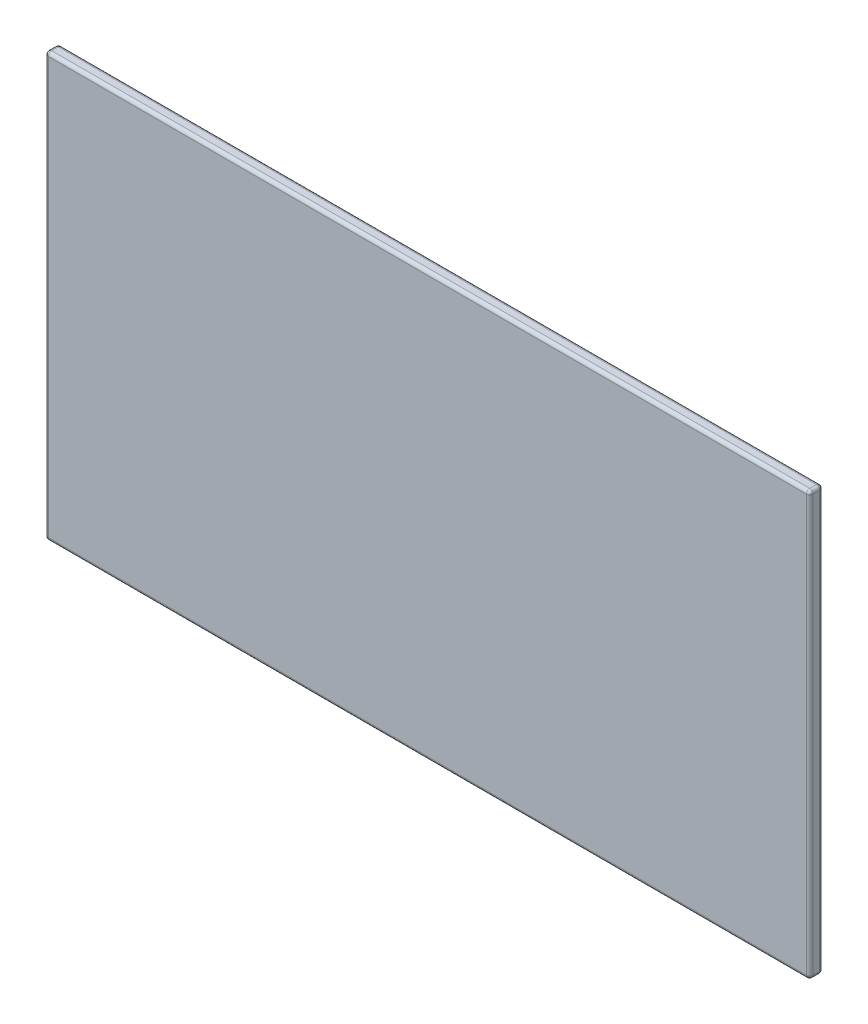
ISO-10303-21;
HEADER;
FILE_DESCRIPTION(('STEP AP214'),'2;1');
FILE_NAME('part.step','',(''),(''),'','','');
FILE_SCHEMA(('AUTOMOTIVE_DESIGN { 1 0 10303 214 1 1 1 1 }'));
ENDSEC;
DATA;
#1=APPLICATION_CONTEXT('core data for automotive mechanical design processes');
#2=APPLICATION_PROTOCOL_DEFINITION('international standard','automotive_design',2000,#1);
#3=PRODUCT_CONTEXT('',#1,'mechanical');
#4=PRODUCT('Part','Part','',(#3));
#5=PRODUCT_RELATED_PRODUCT_CATEGORY('part','',(#4));
#6=PRODUCT_DEFINITION_FORMATION('','',#4);
#7=PRODUCT_DEFINITION_CONTEXT('part definition',#1,'design');
#8=PRODUCT_DEFINITION('design','',#6,#7);
#9=PRODUCT_DEFINITION_SHAPE('','',#8);
#10=(LENGTH_UNIT() NAMED_UNIT(*) SI_UNIT(.MILLI.,.METRE.));
#11=(NAMED_UNIT(*) PLANE_ANGLE_UNIT() SI_UNIT($,.RADIAN.));
#12=(NAMED_UNIT(*) SI_UNIT($,.STERADIAN.) SOLID_ANGLE_UNIT());
#13=UNCERTAINTY_MEASURE_WITH_UNIT(LENGTH_MEASURE(1.E-05),#10,'distance_accuracy_value','');
#14=(GEOMETRIC_REPRESENTATION_CONTEXT(3) GLOBAL_UNCERTAINTY_ASSIGNED_CONTEXT((#13)) GLOBAL_UNIT_ASSIGNED_CONTEXT((#10,
#11,#12)) REPRESENTATION_CONTEXT('',''));
#15=CARTESIAN_POINT('',(0.,0.,0.));
#16=DIRECTION('',(0.,0.,1.));
#17=DIRECTION('',(1.,0.,0.));
#18=AXIS2_PLACEMENT_3D('',#15,#16,#17);
#19=CARTESIAN_POINT('',(57.35,-31.75,2.));
#20=DIRECTION('',(-1.,0.,0.));
#21=DIRECTION('',(0.,0.,1.));
#22=AXIS2_PLACEMENT_3D('',#19,#20,#21);
#23=PLANE('',#22);
#24=DIRECTION('',(0.,1.,0.));
#25=VECTOR('',#24,1.);
#26=CARTESIAN_POINT('',(57.35,-31.75,1.5));
#27=LINE('',#26,#25);
#28=CARTESIAN_POINT('',(57.35,31.25,1.5));
#29=VERTEX_POINT('',#28);
#30=CARTESIAN_POINT('',(57.35,-31.25,1.5));
#31=VERTEX_POINT('',#30);
#32=EDGE_CURVE('E42',#29,#31,#27,.F.);
#33=ORIENTED_EDGE('',*,*,#32,.T.);
#34=DIRECTION('',(0.,0.,-1.));
#35=VECTOR('',#34,1.);
#36=CARTESIAN_POINT('',(57.35,-31.25,2.));
#37=LINE('',#36,#35);
#38=CARTESIAN_POINT('',(57.35,-31.25,0.5));
#39=VERTEX_POINT('',#38);
#40=EDGE_CURVE('E11',#31,#39,#37,.T.);
#41=ORIENTED_EDGE('',*,*,#40,.T.);
#42=DIRECTION('',(0.,1.,0.));
#43=VECTOR('',#42,1.);
#44=CARTESIAN_POINT('',(57.35,31.75,0.5));
#45=LINE('',#44,#43);
#46=CARTESIAN_POINT('',(57.35,31.25,0.5));
#47=VERTEX_POINT('',#46);
#48=EDGE_CURVE('E194',#39,#47,#45,.T.);
#49=ORIENTED_EDGE('',*,*,#48,.T.);
#50=DIRECTION('',(0.,0.,-1.));
#51=VECTOR('',#50,1.);
#52=CARTESIAN_POINT('',(57.35,31.25,2.));
#53=LINE('',#52,#51);
#54=EDGE_CURVE('E53',#47,#29,#53,.F.);
#55=ORIENTED_EDGE('',*,*,#54,.T.);
#56=EDGE_LOOP('',(#33,#41,#49,#55));
#57=FACE_BOUND('',#56,.T.);
#58=ADVANCED_FACE('F33',(#57),#23,.F.);
#59=CARTESIAN_POINT('',(-57.35,31.75,2.));
#60=DIRECTION('',(0.,-1.,0.));
#61=DIRECTION('',(0.,0.,-1.));
#62=AXIS2_PLACEMENT_3D('',#59,#60,#61);
#63=PLANE('',#62);
#64=DIRECTION('',(0.,0.,-1.));
#65=VECTOR('',#64,1.);
#66=CARTESIAN_POINT('',(-56.85,31.75,2.));
#67=LINE('',#66,#65);
#68=CARTESIAN_POINT('',(-56.85,31.75,0.5));
#69=VERTEX_POINT('',#68);
#70=CARTESIAN_POINT('',(-56.85,31.75,1.5));
#71=VERTEX_POINT('',#70);
#72=EDGE_CURVE('E189',#69,#71,#67,.F.);
#73=ORIENTED_EDGE('',*,*,#72,.T.);
#74=DIRECTION('',(-1.,0.,0.));
#75=VECTOR('',#74,1.);
#76=CARTESIAN_POINT('',(-57.35,31.75,1.5));
#77=LINE('',#76,#75);
#78=CARTESIAN_POINT('',(56.85,31.75,1.5));
#79=VERTEX_POINT('',#78);
#80=EDGE_CURVE('E191',#71,#79,#77,.F.);
#81=ORIENTED_EDGE('',*,*,#80,.T.);
#82=DIRECTION('',(0.,0.,-1.));
#83=VECTOR('',#82,1.);
#84=CARTESIAN_POINT('',(56.85,31.75,2.));
#85=LINE('',#84,#83);
#86=CARTESIAN_POINT('',(56.85,31.75,0.5));
#87=VERTEX_POINT('',#86);
#88=EDGE_CURVE('E185',#79,#87,#85,.T.);
#89=ORIENTED_EDGE('',*,*,#88,.T.);
#90=DIRECTION('',(-1.,0.,0.));
#91=VECTOR('',#90,1.);
#92=CARTESIAN_POINT('',(-57.35,31.75,0.5));
#93=LINE('',#92,#91);
#94=EDGE_CURVE('E187',#87,#69,#93,.T.);
#95=ORIENTED_EDGE('',*,*,#94,.T.);
#96=EDGE_LOOP('',(#73,#81,#89,#95));
#97=FACE_BOUND('',#96,.T.);
#98=ADVANCED_FACE('F278',(#97),#63,.F.);
#99=CARTESIAN_POINT('',(-57.35,-31.75,2.));
#100=DIRECTION('',(1.,0.,0.));
#101=DIRECTION('',(0.,0.,-1.));
#102=AXIS2_PLACEMENT_3D('',#99,#100,#101);
#103=PLANE('',#102);
#104=DIRECTION('',(0.,0.,-1.));
#105=VECTOR('',#104,1.);
#106=CARTESIAN_POINT('',(-57.35,-31.25,2.));
#107=LINE('',#106,#105);
#108=CARTESIAN_POINT('',(-57.35,-31.25,0.5));
#109=VERTEX_POINT('',#108);
#110=CARTESIAN_POINT('',(-57.35,-31.25,1.5));
#111=VERTEX_POINT('',#110);
#112=EDGE_CURVE('E180',#109,#111,#107,.F.);
#113=ORIENTED_EDGE('',*,*,#112,.T.);
#114=DIRECTION('',(0.,-1.,0.));
#115=VECTOR('',#114,1.);
#116=CARTESIAN_POINT('',(-57.35,-31.75,1.5));
#117=LINE('',#116,#115);
#118=CARTESIAN_POINT('',(-57.35,31.25,1.5));
#119=VERTEX_POINT('',#118);
#120=EDGE_CURVE('E182',#111,#119,#117,.F.);
#121=ORIENTED_EDGE('',*,*,#120,.T.);
#122=DIRECTION('',(0.,0.,-1.));
#123=VECTOR('',#122,1.);
#124=CARTESIAN_POINT('',(-57.35,31.25,2.));
#125=LINE('',#124,#123);
#126=CARTESIAN_POINT('',(-57.35,31.25,0.5));
#127=VERTEX_POINT('',#126);
#128=EDGE_CURVE('E176',#119,#127,#125,.T.);
#129=ORIENTED_EDGE('',*,*,#128,.T.);
#130=DIRECTION('',(0.,-1.,0.));
#131=VECTOR('',#130,1.);
#132=CARTESIAN_POINT('',(-57.35,-31.75,0.5));
#133=LINE('',#132,#131);
#134=EDGE_CURVE('E178',#127,#109,#133,.T.);
#135=ORIENTED_EDGE('',*,*,#134,.T.);
#136=EDGE_LOOP('',(#113,#121,#129,#135));
#137=FACE_BOUND('',#136,.T.);
#138=ADVANCED_FACE('F269',(#137),#103,.F.);
#139=CARTESIAN_POINT('',(-57.35,-31.75,2.));
#140=DIRECTION('',(0.,1.,0.));
#141=DIRECTION('',(0.,0.,1.));
#142=AXIS2_PLACEMENT_3D('',#139,#140,#141);
#143=PLANE('',#142);
#144=DIRECTION('',(1.,0.,0.));
#145=VECTOR('',#144,1.);
#146=CARTESIAN_POINT('',(-57.35,-31.75,1.5));
#147=LINE('',#146,#145);
#148=CARTESIAN_POINT('',(56.85,-31.75,1.5));
#149=VERTEX_POINT('',#148);
#150=CARTESIAN_POINT('',(-56.85,-31.75,1.5));
#151=VERTEX_POINT('',#150);
#152=EDGE_CURVE('E129',#149,#151,#147,.F.);
#153=ORIENTED_EDGE('',*,*,#152,.T.);
#154=DIRECTION('',(0.,0.,-1.));
#155=VECTOR('',#154,1.);
#156=CARTESIAN_POINT('',(-56.85,-31.75,2.));
#157=LINE('',#156,#155);
#158=CARTESIAN_POINT('',(-56.85,-31.75,0.5));
#159=VERTEX_POINT('',#158);
#160=EDGE_CURVE('E165',#151,#159,#157,.T.);
#161=ORIENTED_EDGE('',*,*,#160,.T.);
#162=DIRECTION('',(1.,0.,0.));
#163=VECTOR('',#162,1.);
#164=CARTESIAN_POINT('',(57.35,-31.75,0.5));
#165=LINE('',#164,#163);
#166=CARTESIAN_POINT('',(56.85,-31.75,0.5));
#167=VERTEX_POINT('',#166);
#168=EDGE_CURVE('E158',#159,#167,#165,.T.);
#169=ORIENTED_EDGE('',*,*,#168,.T.);
#170=DIRECTION('',(0.,0.,-1.));
#171=VECTOR('',#170,1.);
#172=CARTESIAN_POINT('',(56.85,-31.75,2.));
#173=LINE('',#172,#171);
#174=EDGE_CURVE('E156',#167,#149,#173,.F.);
#175=ORIENTED_EDGE('',*,*,#174,.T.);
#176=EDGE_LOOP('',(#153,#161,#169,#175));
#177=FACE_BOUND('',#176,.T.);
#178=ADVANCED_FACE('F356',(#177),#143,.F.);
#179=CARTESIAN_POINT('',(0.,0.,2.));
#180=DIRECTION('',(0.,0.,-1.));
#181=DIRECTION('',(-1.,0.,0.));
#182=AXIS2_PLACEMENT_3D('',#179,#180,#181);
#183=PLANE('',#182);
#184=DIRECTION('',(0.,-1.,0.));
#185=VECTOR('',#184,1.);
#186=CARTESIAN_POINT('',(-56.85,0.,2.));
#187=LINE('',#186,#185);
#188=CARTESIAN_POINT('',(-56.85,31.25,2.));
#189=VERTEX_POINT('',#188);
#190=CARTESIAN_POINT('',(-56.85,-31.25,2.));
#191=VERTEX_POINT('',#190);
#192=EDGE_CURVE('E154',#189,#191,#187,.T.);
#193=ORIENTED_EDGE('',*,*,#192,.T.);
#194=DIRECTION('',(1.,0.,0.));
#195=VECTOR('',#194,1.);
#196=CARTESIAN_POINT('',(0.,-31.25,2.));
#197=LINE('',#196,#195);
#198=CARTESIAN_POINT('',(56.85,-31.25,2.));
#199=VERTEX_POINT('',#198);
#200=EDGE_CURVE('E127',#191,#199,#197,.T.);
#201=ORIENTED_EDGE('',*,*,#200,.T.);
#202=DIRECTION('',(0.,1.,0.));
#203=VECTOR('',#202,1.);
#204=CARTESIAN_POINT('',(56.85,0.,2.));
#205=LINE('',#204,#203);
#206=CARTESIAN_POINT('',(56.85,31.25,2.));
#207=VERTEX_POINT('',#206);
#208=EDGE_CURVE('E144',#199,#207,#205,.T.);
#209=ORIENTED_EDGE('',*,*,#208,.T.);
#210=DIRECTION('',(-1.,0.,0.));
#211=VECTOR('',#210,1.);
#212=CARTESIAN_POINT('',(0.,31.25,2.));
#213=LINE('',#212,#211);
#214=EDGE_CURVE('E150',#207,#189,#213,.T.);
#215=ORIENTED_EDGE('',*,*,#214,.T.);
#216=EDGE_LOOP('',(#193,#201,#209,#215));
#217=FACE_BOUND('',#216,.T.);
#218=ADVANCED_FACE('F152',(#217),#183,.F.);
#219=CARTESIAN_POINT('',(0.,0.,0.));
#220=DIRECTION('',(0.,0.,-1.));
#221=DIRECTION('',(-1.,0.,0.));
#222=AXIS2_PLACEMENT_3D('',#219,#220,#221);
#223=PLANE('',#222);
#224=DIRECTION('',(0.,1.,0.));
#225=VECTOR('',#224,1.);
#226=CARTESIAN_POINT('',(56.85,-31.75,0.));
#227=LINE('',#226,#225);
#228=CARTESIAN_POINT('',(56.85,31.25,0.));
#229=VERTEX_POINT('',#228);
#230=CARTESIAN_POINT('',(56.85,-31.25,0.));
#231=VERTEX_POINT('',#230);
#232=EDGE_CURVE('E167',#229,#231,#227,.F.);
#233=ORIENTED_EDGE('',*,*,#232,.T.);
#234=DIRECTION('',(1.,0.,0.));
#235=VECTOR('',#234,1.);
#236=CARTESIAN_POINT('',(-57.35,-31.25,0.));
#237=LINE('',#236,#235);
#238=CARTESIAN_POINT('',(-56.85,-31.25,0.));
#239=VERTEX_POINT('',#238);
#240=EDGE_CURVE('E173',#231,#239,#237,.F.);
#241=ORIENTED_EDGE('',*,*,#240,.T.);
#242=DIRECTION('',(0.,-1.,0.));
#243=VECTOR('',#242,1.);
#244=CARTESIAN_POINT('',(-56.85,31.75,0.));
#245=LINE('',#244,#243);
#246=CARTESIAN_POINT('',(-56.85,31.25,0.));
#247=VERTEX_POINT('',#246);
#248=EDGE_CURVE('E171',#239,#247,#245,.F.);
#249=ORIENTED_EDGE('',*,*,#248,.T.);
#250=DIRECTION('',(-1.,0.,0.));
#251=VECTOR('',#250,1.);
#252=CARTESIAN_POINT('',(57.35,31.25,0.));
#253=LINE('',#252,#251);
#254=EDGE_CURVE('E169',#247,#229,#253,.F.);
#255=ORIENTED_EDGE('',*,*,#254,.T.);
#256=EDGE_LOOP('',(#233,#241,#249,#255));
#257=FACE_BOUND('',#256,.T.);
#258=ADVANCED_FACE('F296',(#257),#223,.T.);
#259=CARTESIAN_POINT('',(-57.35,31.25,0.5));
#260=DIRECTION('',(1.,0.,0.));
#261=DIRECTION('',(0.,0.,-1.));
#262=AXIS2_PLACEMENT_3D('',#259,#260,#261);
#263=CYLINDRICAL_SURFACE('',#262,0.5);
#264=CARTESIAN_POINT('',(-56.85,31.25,0.5));
#265=DIRECTION('',(-1.,0.,0.));
#266=DIRECTION('',(0.,0.,1.));
#267=AXIS2_PLACEMENT_3D('',#264,#265,#266);
#268=CIRCLE('',#267,0.5);
#269=EDGE_CURVE('E37',#69,#247,#268,.T.);
#270=ORIENTED_EDGE('',*,*,#269,.F.);
#271=ORIENTED_EDGE('',*,*,#94,.F.);
#272=CARTESIAN_POINT('',(56.85,31.25,0.5));
#273=DIRECTION('',(1.,0.,0.));
#274=DIRECTION('',(0.,0.,-1.));
#275=AXIS2_PLACEMENT_3D('',#272,#273,#274);
#276=CIRCLE('',#275,0.5);
#277=EDGE_CURVE('E246',#229,#87,#276,.T.);
#278=ORIENTED_EDGE('',*,*,#277,.F.);
#279=ORIENTED_EDGE('',*,*,#254,.F.);
#280=EDGE_LOOP('',(#270,#271,#278,#279));
#281=FACE_BOUND('',#280,.T.);
#282=ADVANCED_FACE('F35',(#281),#263,.T.);
#283=CARTESIAN_POINT('',(-56.85,31.25,0.5));
#284=DIRECTION('',(0.,0.,1.));
#285=DIRECTION('',(1.,0.,0.));
#286=AXIS2_PLACEMENT_3D('',#283,#284,#285);
#287=SPHERICAL_SURFACE('',#286,0.5);
#288=CARTESIAN_POINT('',(-56.85,31.25,0.5));
#289=DIRECTION('',(0.,0.,-1.));
#290=DIRECTION('',(-1.,0.,0.));
#291=AXIS2_PLACEMENT_3D('',#288,#289,#290);
#292=CIRCLE('',#291,0.5);
#293=EDGE_CURVE('E241',#69,#127,#292,.F.);
#294=ORIENTED_EDGE('',*,*,#293,.F.);
#295=ORIENTED_EDGE('',*,*,#269,.T.);
#296=CARTESIAN_POINT('',(-56.85,31.25,0.5));
#297=DIRECTION('',(0.,1.,0.));
#298=DIRECTION('',(0.,0.,1.));
#299=AXIS2_PLACEMENT_3D('',#296,#297,#298);
#300=CIRCLE('',#299,0.5);
#301=EDGE_CURVE('E244',#127,#247,#300,.F.);
#302=ORIENTED_EDGE('',*,*,#301,.F.);
#303=EDGE_LOOP('',(#294,#295,#302));
#304=FACE_BOUND('',#303,.T.);
#305=ADVANCED_FACE('F257',(#304),#287,.T.);
#306=CARTESIAN_POINT('',(56.85,31.25,0.5));
#307=DIRECTION('',(0.,0.,1.));
#308=DIRECTION('',(1.,0.,0.));
#309=AXIS2_PLACEMENT_3D('',#306,#307,#308);
#310=SPHERICAL_SURFACE('',#309,0.5);
#311=CARTESIAN_POINT('',(56.85,31.25,0.5));
#312=DIRECTION('',(0.,1.,0.));
#313=DIRECTION('',(0.,0.,1.));
#314=AXIS2_PLACEMENT_3D('',#311,#312,#313);
#315=CIRCLE('',#314,0.5);
#316=EDGE_CURVE('E235',#229,#47,#315,.F.);
#317=ORIENTED_EDGE('',*,*,#316,.F.);
#318=ORIENTED_EDGE('',*,*,#277,.T.);
#319=CARTESIAN_POINT('',(56.85,31.25,0.5));
#320=DIRECTION('',(0.,0.,-1.));
#321=DIRECTION('',(-1.,0.,0.));
#322=AXIS2_PLACEMENT_3D('',#319,#320,#321);
#323=CIRCLE('',#322,0.5);
#324=EDGE_CURVE('E238',#47,#87,#323,.F.);
#325=ORIENTED_EDGE('',*,*,#324,.F.);
#326=EDGE_LOOP('',(#317,#318,#325));
#327=FACE_BOUND('',#326,.T.);
#328=ADVANCED_FACE('F289',(#327),#310,.T.);
#329=CARTESIAN_POINT('',(-56.85,-31.75,0.5));
#330=DIRECTION('',(0.,1.,0.));
#331=DIRECTION('',(0.,0.,1.));
#332=AXIS2_PLACEMENT_3D('',#329,#330,#331);
#333=CYLINDRICAL_SURFACE('',#332,0.5);
#334=ORIENTED_EDGE('',*,*,#301,.T.);
#335=ORIENTED_EDGE('',*,*,#248,.F.);
#336=CARTESIAN_POINT('',(-56.85,-31.25,0.5));
#337=DIRECTION('',(0.,-1.,0.));
#338=DIRECTION('',(0.,0.,-1.));
#339=AXIS2_PLACEMENT_3D('',#336,#337,#338);
#340=CIRCLE('',#339,0.5);
#341=EDGE_CURVE('E230',#109,#239,#340,.T.);
#342=ORIENTED_EDGE('',*,*,#341,.F.);
#343=ORIENTED_EDGE('',*,*,#134,.F.);
#344=EDGE_LOOP('',(#334,#335,#342,#343));
#345=FACE_BOUND('',#344,.T.);
#346=ADVANCED_FACE('F265',(#345),#333,.T.);
#347=CARTESIAN_POINT('',(-56.85,31.25,2.));
#348=DIRECTION('',(0.,0.,-1.));
#349=DIRECTION('',(-1.,0.,0.));
#350=AXIS2_PLACEMENT_3D('',#347,#348,#349);
#351=CYLINDRICAL_SURFACE('',#350,0.5);
#352=ORIENTED_EDGE('',*,*,#293,.T.);
#353=ORIENTED_EDGE('',*,*,#128,.F.);
#354=CARTESIAN_POINT('',(-56.85,31.25,1.5));
#355=DIRECTION('',(0.,0.,1.));
#356=DIRECTION('',(1.,0.,0.));
#357=AXIS2_PLACEMENT_3D('',#354,#355,#356);
#358=CIRCLE('',#357,0.5);
#359=EDGE_CURVE('E227',#71,#119,#358,.T.);
#360=ORIENTED_EDGE('',*,*,#359,.F.);
#361=ORIENTED_EDGE('',*,*,#72,.F.);
#362=EDGE_LOOP('',(#352,#353,#360,#361));
#363=FACE_BOUND('',#362,.T.);
#364=ADVANCED_FACE('F275',(#363),#351,.T.);
#365=CARTESIAN_POINT('',(0.,31.25,1.5));
#366=DIRECTION('',(-1.,0.,0.));
#367=DIRECTION('',(0.,0.,1.));
#368=AXIS2_PLACEMENT_3D('',#365,#366,#367);
#369=CYLINDRICAL_SURFACE('',#368,0.5);
#370=CARTESIAN_POINT('',(56.85,31.25,1.5));
#371=DIRECTION('',(1.,0.,0.));
#372=DIRECTION('',(0.,0.,-1.));
#373=AXIS2_PLACEMENT_3D('',#370,#371,#372);
#374=CIRCLE('',#373,0.5);
#375=EDGE_CURVE('E221',#79,#207,#374,.T.);
#376=ORIENTED_EDGE('',*,*,#375,.F.);
#377=ORIENTED_EDGE('',*,*,#80,.F.);
#378=CARTESIAN_POINT('',(-56.85,31.25,1.5));
#379=DIRECTION('',(-1.,0.,0.));
#380=DIRECTION('',(0.,0.,1.));
#381=AXIS2_PLACEMENT_3D('',#378,#379,#380);
#382=CIRCLE('',#381,0.5);
#383=EDGE_CURVE('E224',#189,#71,#382,.T.);
#384=ORIENTED_EDGE('',*,*,#383,.F.);
#385=ORIENTED_EDGE('',*,*,#214,.F.);
#386=EDGE_LOOP('',(#376,#377,#384,#385));
#387=FACE_BOUND('',#386,.T.);
#388=ADVANCED_FACE('F282',(#387),#369,.T.);
#389=CARTESIAN_POINT('',(56.85,31.25,2.));
#390=DIRECTION('',(0.,0.,-1.));
#391=DIRECTION('',(-1.,0.,0.));
#392=AXIS2_PLACEMENT_3D('',#389,#390,#391);
#393=CYLINDRICAL_SURFACE('',#392,0.5);
#394=ORIENTED_EDGE('',*,*,#324,.T.);
#395=ORIENTED_EDGE('',*,*,#88,.F.);
#396=CARTESIAN_POINT('',(56.85,31.25,1.5));
#397=DIRECTION('',(0.,0.,1.));
#398=DIRECTION('',(1.,0.,0.));
#399=AXIS2_PLACEMENT_3D('',#396,#397,#398);
#400=CIRCLE('',#399,0.5);
#401=EDGE_CURVE('E219',#29,#79,#400,.T.);
#402=ORIENTED_EDGE('',*,*,#401,.F.);
#403=ORIENTED_EDGE('',*,*,#54,.F.);
#404=EDGE_LOOP('',(#394,#395,#402,#403));
#405=FACE_BOUND('',#404,.T.);
#406=ADVANCED_FACE('F287',(#405),#393,.T.);
#407=CARTESIAN_POINT('',(56.85,-31.75,0.5));
#408=DIRECTION('',(0.,-1.,0.));
#409=DIRECTION('',(0.,0.,-1.));
#410=AXIS2_PLACEMENT_3D('',#407,#408,#409);
#411=CYLINDRICAL_SURFACE('',#410,0.5);
#412=ORIENTED_EDGE('',*,*,#316,.T.);
#413=ORIENTED_EDGE('',*,*,#48,.F.);
#414=CARTESIAN_POINT('',(56.85,-31.25,0.5));
#415=DIRECTION('',(0.,-1.,0.));
#416=DIRECTION('',(0.,0.,-1.));
#417=AXIS2_PLACEMENT_3D('',#414,#415,#416);
#418=CIRCLE('',#417,0.5);
#419=EDGE_CURVE('E216',#231,#39,#418,.T.);
#420=ORIENTED_EDGE('',*,*,#419,.F.);
#421=ORIENTED_EDGE('',*,*,#232,.F.);
#422=EDGE_LOOP('',(#412,#413,#420,#421));
#423=FACE_BOUND('',#422,.T.);
#424=ADVANCED_FACE('F293',(#423),#411,.T.);
#425=CARTESIAN_POINT('',(-57.35,-31.25,0.5));
#426=DIRECTION('',(-1.,0.,0.));
#427=DIRECTION('',(0.,0.,1.));
#428=AXIS2_PLACEMENT_3D('',#425,#426,#427);
#429=CYLINDRICAL_SURFACE('',#428,0.5);
#430=CARTESIAN_POINT('',(-56.85,-31.25,0.5));
#431=DIRECTION('',(-1.,0.,0.));
#432=DIRECTION('',(0.,0.,1.));
#433=AXIS2_PLACEMENT_3D('',#430,#431,#432);
#434=CIRCLE('',#433,0.5);
#435=EDGE_CURVE('E232',#239,#159,#434,.T.);
#436=ORIENTED_EDGE('',*,*,#435,.F.);
#437=ORIENTED_EDGE('',*,*,#240,.F.);
#438=CARTESIAN_POINT('',(56.85,-31.25,0.5));
#439=DIRECTION('',(1.,0.,0.));
#440=DIRECTION('',(0.,0.,-1.));
#441=AXIS2_PLACEMENT_3D('',#438,#439,#440);
#442=CIRCLE('',#441,0.5);
#443=EDGE_CURVE('E213',#167,#231,#442,.T.);
#444=ORIENTED_EDGE('',*,*,#443,.F.);
#445=ORIENTED_EDGE('',*,*,#168,.F.);
#446=EDGE_LOOP('',(#436,#437,#444,#445));
#447=FACE_BOUND('',#446,.T.);
#448=ADVANCED_FACE('F300',(#447),#429,.T.);
#449=CARTESIAN_POINT('',(-56.85,-31.25,0.5));
#450=DIRECTION('',(0.,0.,1.));
#451=DIRECTION('',(1.,0.,0.));
#452=AXIS2_PLACEMENT_3D('',#449,#450,#451);
#453=SPHERICAL_SURFACE('',#452,0.5);
#454=ORIENTED_EDGE('',*,*,#341,.T.);
#455=ORIENTED_EDGE('',*,*,#435,.T.);
#456=CARTESIAN_POINT('',(-56.85,-31.25,0.5));
#457=DIRECTION('',(0.,0.,-1.));
#458=DIRECTION('',(-1.,0.,0.));
#459=AXIS2_PLACEMENT_3D('',#456,#457,#458);
#460=CIRCLE('',#459,0.5);
#461=EDGE_CURVE('E210',#109,#159,#460,.F.);
#462=ORIENTED_EDGE('',*,*,#461,.F.);
#463=EDGE_LOOP('',(#454,#455,#462));
#464=FACE_BOUND('',#463,.T.);
#465=ADVANCED_FACE('F304',(#464),#453,.T.);
#466=CARTESIAN_POINT('',(-56.85,31.25,1.5));
#467=DIRECTION('',(0.,0.,1.));
#468=DIRECTION('',(1.,0.,0.));
#469=AXIS2_PLACEMENT_3D('',#466,#467,#468);
#470=SPHERICAL_SURFACE('',#469,0.5);
#471=ORIENTED_EDGE('',*,*,#383,.T.);
#472=ORIENTED_EDGE('',*,*,#359,.T.);
#473=CARTESIAN_POINT('',(-56.85,31.25,1.5));
#474=DIRECTION('',(0.,1.,0.));
#475=DIRECTION('',(0.,0.,1.));
#476=AXIS2_PLACEMENT_3D('',#473,#474,#475);
#477=CIRCLE('',#476,0.5);
#478=EDGE_CURVE('E208',#189,#119,#477,.F.);
#479=ORIENTED_EDGE('',*,*,#478,.F.);
#480=EDGE_LOOP('',(#471,#472,#479));
#481=FACE_BOUND('',#480,.T.);
#482=ADVANCED_FACE('F315',(#481),#470,.T.);
#483=CARTESIAN_POINT('',(56.85,31.25,1.5));
#484=DIRECTION('',(0.,0.,1.));
#485=DIRECTION('',(1.,0.,0.));
#486=AXIS2_PLACEMENT_3D('',#483,#484,#485);
#487=SPHERICAL_SURFACE('',#486,0.5);
#488=ORIENTED_EDGE('',*,*,#401,.T.);
#489=ORIENTED_EDGE('',*,*,#375,.T.);
#490=CARTESIAN_POINT('',(56.85,31.25,1.5));
#491=DIRECTION('',(0.,1.,0.));
#492=DIRECTION('',(0.,0.,1.));
#493=AXIS2_PLACEMENT_3D('',#490,#491,#492);
#494=CIRCLE('',#493,0.5);
#495=EDGE_CURVE('E147',#29,#207,#494,.F.);
#496=ORIENTED_EDGE('',*,*,#495,.F.);
#497=EDGE_LOOP('',(#488,#489,#496));
#498=FACE_BOUND('',#497,.T.);
#499=ADVANCED_FACE('F317',(#498),#487,.T.);
#500=CARTESIAN_POINT('',(56.85,-31.25,0.5));
#501=DIRECTION('',(0.,0.,1.));
#502=DIRECTION('',(1.,0.,0.));
#503=AXIS2_PLACEMENT_3D('',#500,#501,#502);
#504=SPHERICAL_SURFACE('',#503,0.5);
#505=ORIENTED_EDGE('',*,*,#443,.T.);
#506=ORIENTED_EDGE('',*,*,#419,.T.);
#507=CARTESIAN_POINT('',(56.85,-31.25,0.5));
#508=DIRECTION('',(0.,0.,-1.));
#509=DIRECTION('',(-1.,0.,0.));
#510=AXIS2_PLACEMENT_3D('',#507,#508,#509);
#511=CIRCLE('',#510,0.5);
#512=EDGE_CURVE('E205',#167,#39,#511,.F.);
#513=ORIENTED_EDGE('',*,*,#512,.F.);
#514=EDGE_LOOP('',(#505,#506,#513));
#515=FACE_BOUND('',#514,.T.);
#516=ADVANCED_FACE('F323',(#515),#504,.T.);
#517=CARTESIAN_POINT('',(-56.85,-31.25,2.));
#518=DIRECTION('',(0.,0.,-1.));
#519=DIRECTION('',(-1.,0.,0.));
#520=AXIS2_PLACEMENT_3D('',#517,#518,#519);
#521=CYLINDRICAL_SURFACE('',#520,0.5);
#522=ORIENTED_EDGE('',*,*,#461,.T.);
#523=ORIENTED_EDGE('',*,*,#160,.F.);
#524=CARTESIAN_POINT('',(-56.85,-31.25,1.5));
#525=DIRECTION('',(0.,0.,1.));
#526=DIRECTION('',(1.,0.,0.));
#527=AXIS2_PLACEMENT_3D('',#524,#525,#526);
#528=CIRCLE('',#527,0.5);
#529=EDGE_CURVE('E202',#111,#151,#528,.T.);
#530=ORIENTED_EDGE('',*,*,#529,.F.);
#531=ORIENTED_EDGE('',*,*,#112,.F.);
#532=EDGE_LOOP('',(#522,#523,#530,#531));
#533=FACE_BOUND('',#532,.T.);
#534=ADVANCED_FACE('F307',(#533),#521,.T.);
#535=CARTESIAN_POINT('',(-56.85,0.,1.5));
#536=DIRECTION('',(0.,-1.,0.));
#537=DIRECTION('',(0.,0.,-1.));
#538=AXIS2_PLACEMENT_3D('',#535,#536,#537);
#539=CYLINDRICAL_SURFACE('',#538,0.5);
#540=ORIENTED_EDGE('',*,*,#478,.T.);
#541=ORIENTED_EDGE('',*,*,#120,.F.);
#542=CARTESIAN_POINT('',(-56.85,-31.25,1.5));
#543=DIRECTION('',(0.,-1.,0.));
#544=DIRECTION('',(0.,0.,-1.));
#545=AXIS2_PLACEMENT_3D('',#542,#543,#544);
#546=CIRCLE('',#545,0.5);
#547=EDGE_CURVE('E141',#191,#111,#546,.T.);
#548=ORIENTED_EDGE('',*,*,#547,.F.);
#549=ORIENTED_EDGE('',*,*,#192,.F.);
#550=EDGE_LOOP('',(#540,#541,#548,#549));
#551=FACE_BOUND('',#550,.T.);
#552=ADVANCED_FACE('F313',(#551),#539,.T.);
#553=CARTESIAN_POINT('',(56.85,0.,1.5));
#554=DIRECTION('',(0.,1.,0.));
#555=DIRECTION('',(0.,0.,1.));
#556=AXIS2_PLACEMENT_3D('',#553,#554,#555);
#557=CYLINDRICAL_SURFACE('',#556,0.5);
#558=ORIENTED_EDGE('',*,*,#495,.T.);
#559=ORIENTED_EDGE('',*,*,#208,.F.);
#560=CARTESIAN_POINT('',(56.85,-31.25,1.5));
#561=DIRECTION('',(0.,-1.,0.));
#562=DIRECTION('',(0.,0.,-1.));
#563=AXIS2_PLACEMENT_3D('',#560,#561,#562);
#564=CIRCLE('',#563,0.5);
#565=EDGE_CURVE('E135',#31,#199,#564,.T.);
#566=ORIENTED_EDGE('',*,*,#565,.F.);
#567=ORIENTED_EDGE('',*,*,#32,.F.);
#568=EDGE_LOOP('',(#558,#559,#566,#567));
#569=FACE_BOUND('',#568,.T.);
#570=ADVANCED_FACE('F145',(#569),#557,.T.);
#571=CARTESIAN_POINT('',(56.85,-31.25,2.));
#572=DIRECTION('',(0.,0.,-1.));
#573=DIRECTION('',(-1.,0.,0.));
#574=AXIS2_PLACEMENT_3D('',#571,#572,#573);
#575=CYLINDRICAL_SURFACE('',#574,0.5);
#576=ORIENTED_EDGE('',*,*,#512,.T.);
#577=ORIENTED_EDGE('',*,*,#40,.F.);
#578=CARTESIAN_POINT('',(56.85,-31.25,1.5));
#579=DIRECTION('',(0.,0.,1.));
#580=DIRECTION('',(1.,0.,0.));
#581=AXIS2_PLACEMENT_3D('',#578,#579,#580);
#582=CIRCLE('',#581,0.5);
#583=EDGE_CURVE('E139',#149,#31,#582,.T.);
#584=ORIENTED_EDGE('',*,*,#583,.F.);
#585=ORIENTED_EDGE('',*,*,#174,.F.);
#586=EDGE_LOOP('',(#576,#577,#584,#585));
#587=FACE_BOUND('',#586,.T.);
#588=ADVANCED_FACE('F340',(#587),#575,.T.);
#589=CARTESIAN_POINT('',(-56.85,-31.25,1.5));
#590=DIRECTION('',(0.,0.,1.));
#591=DIRECTION('',(1.,0.,0.));
#592=AXIS2_PLACEMENT_3D('',#589,#590,#591);
#593=SPHERICAL_SURFACE('',#592,0.5);
#594=ORIENTED_EDGE('',*,*,#547,.T.);
#595=ORIENTED_EDGE('',*,*,#529,.T.);
#596=CARTESIAN_POINT('',(-56.85,-31.25,1.5));
#597=DIRECTION('',(-1.,0.,0.));
#598=DIRECTION('',(0.,0.,1.));
#599=AXIS2_PLACEMENT_3D('',#596,#597,#598);
#600=CIRCLE('',#599,0.5);
#601=EDGE_CURVE('E132',#191,#151,#600,.F.);
#602=ORIENTED_EDGE('',*,*,#601,.F.);
#603=EDGE_LOOP('',(#594,#595,#602));
#604=FACE_BOUND('',#603,.T.);
#605=ADVANCED_FACE('F311',(#604),#593,.T.);
#606=CARTESIAN_POINT('',(56.85,-31.25,1.5));
#607=DIRECTION('',(0.,0.,1.));
#608=DIRECTION('',(1.,0.,0.));
#609=AXIS2_PLACEMENT_3D('',#606,#607,#608);
#610=SPHERICAL_SURFACE('',#609,0.5);
#611=ORIENTED_EDGE('',*,*,#583,.T.);
#612=ORIENTED_EDGE('',*,*,#565,.T.);
#613=CARTESIAN_POINT('',(56.85,-31.25,1.5));
#614=DIRECTION('',(1.,0.,0.));
#615=DIRECTION('',(0.,0.,-1.));
#616=AXIS2_PLACEMENT_3D('',#613,#614,#615);
#617=CIRCLE('',#616,0.5);
#618=EDGE_CURVE('E123',#149,#199,#617,.F.);
#619=ORIENTED_EDGE('',*,*,#618,.F.);
#620=EDGE_LOOP('',(#611,#612,#619));
#621=FACE_BOUND('',#620,.T.);
#622=ADVANCED_FACE('F137',(#621),#610,.T.);
#623=CARTESIAN_POINT('',(0.,-31.25,1.5));
#624=DIRECTION('',(1.,0.,0.));
#625=DIRECTION('',(0.,0.,-1.));
#626=AXIS2_PLACEMENT_3D('',#623,#624,#625);
#627=CYLINDRICAL_SURFACE('',#626,0.5);
#628=ORIENTED_EDGE('',*,*,#601,.T.);
#629=ORIENTED_EDGE('',*,*,#152,.F.);
#630=ORIENTED_EDGE('',*,*,#618,.T.);
#631=ORIENTED_EDGE('',*,*,#200,.F.);
#632=EDGE_LOOP('',(#628,#629,#630,#631));
#633=FACE_BOUND('',#632,.T.);
#634=ADVANCED_FACE('F125',(#633),#627,.T.);
#635=CLOSED_SHELL('',(#58,#98,#138,#178,#218,#258,#282,#305,#328,#346,#364,#388,#406,#424,#448,
#465,#482,#499,#516,#534,#552,#570,#588,#605,#622,#634));
#636=MANIFOLD_SOLID_BREP('B2',#635);
#637=ADVANCED_BREP_SHAPE_REPRESENTATION('',(#18,#636),#14);
#638=SHAPE_DEFINITION_REPRESENTATION(#9,#637);
ENDSEC;
END-ISO-10303-21;
